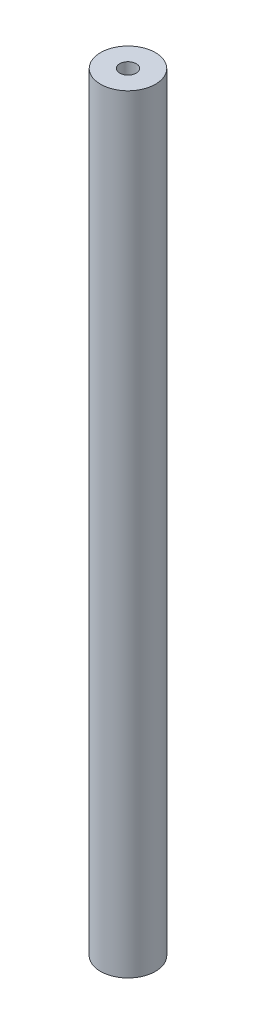
ISO-10303-21;
HEADER;
FILE_DESCRIPTION(('STEP AP214'),'2;1');
FILE_NAME('part.step','',(''),(''),'','','');
FILE_SCHEMA(('AUTOMOTIVE_DESIGN { 1 0 10303 214 1 1 1 1 }'));
ENDSEC;
DATA;
#1=APPLICATION_CONTEXT('core data for automotive mechanical design processes');
#2=APPLICATION_PROTOCOL_DEFINITION('international standard','automotive_design',2000,#1);
#3=PRODUCT_CONTEXT('',#1,'mechanical');
#4=PRODUCT('Part','Part','',(#3));
#5=PRODUCT_RELATED_PRODUCT_CATEGORY('part','',(#4));
#6=PRODUCT_DEFINITION_FORMATION('','',#4);
#7=PRODUCT_DEFINITION_CONTEXT('part definition',#1,'design');
#8=PRODUCT_DEFINITION('design','',#6,#7);
#9=PRODUCT_DEFINITION_SHAPE('','',#8);
#10=(LENGTH_UNIT() NAMED_UNIT(*) SI_UNIT(.MILLI.,.METRE.));
#11=(NAMED_UNIT(*) PLANE_ANGLE_UNIT() SI_UNIT($,.RADIAN.));
#12=(NAMED_UNIT(*) SI_UNIT($,.STERADIAN.) SOLID_ANGLE_UNIT());
#13=UNCERTAINTY_MEASURE_WITH_UNIT(LENGTH_MEASURE(1.E-05),#10,'distance_accuracy_value','');
#14=(GEOMETRIC_REPRESENTATION_CONTEXT(3) GLOBAL_UNCERTAINTY_ASSIGNED_CONTEXT((#13)) GLOBAL_UNIT_ASSIGNED_CONTEXT((#10,
#11,#12)) REPRESENTATION_CONTEXT('',''));
#15=CARTESIAN_POINT('',(0.,0.,0.));
#16=DIRECTION('',(0.,0.,1.));
#17=DIRECTION('',(1.,0.,0.));
#18=AXIS2_PLACEMENT_3D('',#15,#16,#17);
#19=CARTESIAN_POINT('',(0.,140.,0.));
#20=DIRECTION('',(0.,1.,0.));
#21=DIRECTION('',(0.,0.,1.));
#22=AXIS2_PLACEMENT_3D('',#19,#20,#21);
#23=PLANE('',#22);
#24=CARTESIAN_POINT('',(0.,140.,0.));
#25=DIRECTION('',(0.,1.,0.));
#26=DIRECTION('',(0.,0.,1.));
#27=AXIS2_PLACEMENT_3D('',#24,#25,#26);
#28=CIRCLE('',#27,5.);
#29=CARTESIAN_POINT('',(0.,140.,5.));
#30=VERTEX_POINT('',#29);
#31=EDGE_CURVE('E10',#30,#30,#28,.T.);
#32=ORIENTED_EDGE('',*,*,#31,.T.);
#33=EDGE_LOOP('',(#32));
#34=FACE_BOUND('',#33,.T.);
#35=CARTESIAN_POINT('',(0.,140.,0.));
#36=DIRECTION('',(0.,1.,0.));
#37=DIRECTION('',(0.,0.,1.));
#38=AXIS2_PLACEMENT_3D('',#35,#36,#37);
#39=CIRCLE('',#38,1.5);
#40=CARTESIAN_POINT('',(0.,140.,1.5));
#41=VERTEX_POINT('',#40);
#42=EDGE_CURVE('E50',#41,#41,#39,.T.);
#43=ORIENTED_EDGE('',*,*,#42,.F.);
#44=EDGE_LOOP('',(#43));
#45=FACE_BOUND('',#44,.T.);
#46=ADVANCED_FACE('F37',(#34,#45),#23,.T.);
#47=CARTESIAN_POINT('',(0.,0.,0.));
#48=DIRECTION('',(0.,1.,0.));
#49=DIRECTION('',(0.,0.,1.));
#50=AXIS2_PLACEMENT_3D('',#47,#48,#49);
#51=PLANE('',#50);
#52=CARTESIAN_POINT('',(0.,0.,0.));
#53=DIRECTION('',(0.,1.,0.));
#54=DIRECTION('',(0.,0.,1.));
#55=AXIS2_PLACEMENT_3D('',#52,#53,#54);
#56=CIRCLE('',#55,5.);
#57=CARTESIAN_POINT('',(0.,0.,5.));
#58=VERTEX_POINT('',#57);
#59=EDGE_CURVE('E41',#58,#58,#56,.T.);
#60=ORIENTED_EDGE('',*,*,#59,.F.);
#61=EDGE_LOOP('',(#60));
#62=FACE_BOUND('',#61,.T.);
#63=CARTESIAN_POINT('',(0.,0.,0.));
#64=DIRECTION('',(0.,1.,0.));
#65=DIRECTION('',(0.,0.,1.));
#66=AXIS2_PLACEMENT_3D('',#63,#64,#65);
#67=CIRCLE('',#66,1.5);
#68=CARTESIAN_POINT('',(0.,0.,1.5));
#69=VERTEX_POINT('',#68);
#70=EDGE_CURVE('E52',#69,#69,#67,.T.);
#71=ORIENTED_EDGE('',*,*,#70,.T.);
#72=EDGE_LOOP('',(#71));
#73=FACE_BOUND('',#72,.T.);
#74=ADVANCED_FACE('F64',(#62,#73),#51,.F.);
#75=CARTESIAN_POINT('',(0.,140.,0.));
#76=DIRECTION('',(0.,-1.,0.));
#77=DIRECTION('',(0.,0.,-1.));
#78=AXIS2_PLACEMENT_3D('',#75,#76,#77);
#79=CYLINDRICAL_SURFACE('',#78,5.);
#80=ORIENTED_EDGE('',*,*,#31,.F.);
#81=EDGE_LOOP('',(#80));
#82=FACE_BOUND('',#81,.T.);
#83=ORIENTED_EDGE('',*,*,#59,.T.);
#84=EDGE_LOOP('',(#83));
#85=FACE_BOUND('',#84,.T.);
#86=ADVANCED_FACE('F39',(#82,#85),#79,.T.);
#87=CARTESIAN_POINT('',(0.,140.,0.));
#88=DIRECTION('',(0.,-1.,0.));
#89=DIRECTION('',(0.,0.,-1.));
#90=AXIS2_PLACEMENT_3D('',#87,#88,#89);
#91=CYLINDRICAL_SURFACE('',#90,1.5);
#92=ORIENTED_EDGE('',*,*,#42,.T.);
#93=EDGE_LOOP('',(#92));
#94=FACE_BOUND('',#93,.T.);
#95=ORIENTED_EDGE('',*,*,#70,.F.);
#96=EDGE_LOOP('',(#95));
#97=FACE_BOUND('',#96,.T.);
#98=ADVANCED_FACE('F60',(#94,#97),#91,.F.);
#99=CLOSED_SHELL('',(#46,#74,#86,#98));
#100=MANIFOLD_SOLID_BREP('B2',#99);
#101=ADVANCED_BREP_SHAPE_REPRESENTATION('',(#18,#100),#14);
#102=SHAPE_DEFINITION_REPRESENTATION(#9,#101);
ENDSEC;
END-ISO-10303-21;
